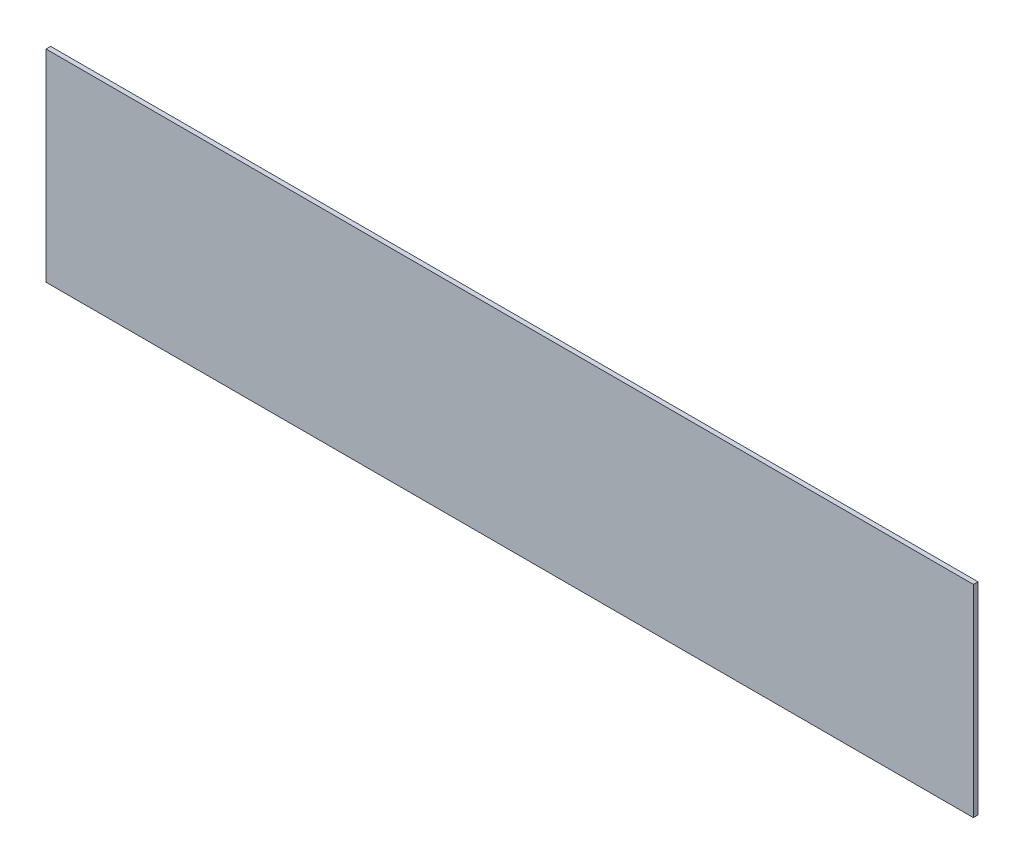
ISO-10303-21;
HEADER;
FILE_DESCRIPTION(('STEP AP214'),'2;1');
FILE_NAME('part.step','',(''),(''),'','','');
FILE_SCHEMA(('AUTOMOTIVE_DESIGN { 1 0 10303 214 1 1 1 1 }'));
ENDSEC;
DATA;
#1=APPLICATION_CONTEXT('core data for automotive mechanical design processes');
#2=APPLICATION_PROTOCOL_DEFINITION('international standard','automotive_design',2000,#1);
#3=PRODUCT_CONTEXT('',#1,'mechanical');
#4=PRODUCT('Part','Part','',(#3));
#5=PRODUCT_RELATED_PRODUCT_CATEGORY('part','',(#4));
#6=PRODUCT_DEFINITION_FORMATION('','',#4);
#7=PRODUCT_DEFINITION_CONTEXT('part definition',#1,'design');
#8=PRODUCT_DEFINITION('design','',#6,#7);
#9=PRODUCT_DEFINITION_SHAPE('','',#8);
#10=(LENGTH_UNIT() NAMED_UNIT(*) SI_UNIT(.MILLI.,.METRE.));
#11=(NAMED_UNIT(*) PLANE_ANGLE_UNIT() SI_UNIT($,.RADIAN.));
#12=(NAMED_UNIT(*) SI_UNIT($,.STERADIAN.) SOLID_ANGLE_UNIT());
#13=UNCERTAINTY_MEASURE_WITH_UNIT(LENGTH_MEASURE(1.E-05),#10,'distance_accuracy_value','');
#14=(GEOMETRIC_REPRESENTATION_CONTEXT(3) GLOBAL_UNCERTAINTY_ASSIGNED_CONTEXT((#13)) GLOBAL_UNIT_ASSIGNED_CONTEXT((#10,
#11,#12)) REPRESENTATION_CONTEXT('',''));
#15=CARTESIAN_POINT('',(0.,0.,0.));
#16=DIRECTION('',(0.,0.,1.));
#17=DIRECTION('',(1.,0.,0.));
#18=AXIS2_PLACEMENT_3D('',#15,#16,#17);
#19=CARTESIAN_POINT('',(1010.,-220.,10.));
#20=DIRECTION('',(-1.,0.,0.));
#21=DIRECTION('',(0.,0.,1.));
#22=AXIS2_PLACEMENT_3D('',#19,#20,#21);
#23=PLANE('',#22);
#24=DIRECTION('',(0.,1.,0.));
#25=VECTOR('',#24,1.);
#26=CARTESIAN_POINT('',(1010.,-220.,0.));
#27=LINE('',#26,#25);
#28=CARTESIAN_POINT('',(1010.,-220.,0.));
#29=VERTEX_POINT('',#28);
#30=CARTESIAN_POINT('',(1010.,220.,0.));
#31=VERTEX_POINT('',#30);
#32=EDGE_CURVE('E102',#29,#31,#27,.T.);
#33=ORIENTED_EDGE('',*,*,#32,.T.);
#34=DIRECTION('',(0.,0.,-1.));
#35=VECTOR('',#34,1.);
#36=CARTESIAN_POINT('',(1010.,220.,10.));
#37=LINE('',#36,#35);
#38=CARTESIAN_POINT('',(1010.,220.,10.));
#39=VERTEX_POINT('',#38);
#40=EDGE_CURVE('E11',#39,#31,#37,.T.);
#41=ORIENTED_EDGE('',*,*,#40,.F.);
#42=DIRECTION('',(0.,1.,0.));
#43=VECTOR('',#42,1.);
#44=CARTESIAN_POINT('',(1010.,-220.,10.));
#45=LINE('',#44,#43);
#46=CARTESIAN_POINT('',(1010.,-220.,10.));
#47=VERTEX_POINT('',#46);
#48=EDGE_CURVE('E90',#47,#39,#45,.T.);
#49=ORIENTED_EDGE('',*,*,#48,.F.);
#50=DIRECTION('',(0.,0.,-1.));
#51=VECTOR('',#50,1.);
#52=CARTESIAN_POINT('',(1010.,-220.,10.));
#53=LINE('',#52,#51);
#54=EDGE_CURVE('E98',#47,#29,#53,.T.);
#55=ORIENTED_EDGE('',*,*,#54,.T.);
#56=EDGE_LOOP('',(#33,#41,#49,#55));
#57=FACE_BOUND('',#56,.T.);
#58=ADVANCED_FACE('F39',(#57),#23,.F.);
#59=CARTESIAN_POINT('',(-1010.,220.,10.));
#60=DIRECTION('',(0.,-1.,0.));
#61=DIRECTION('',(0.,0.,-1.));
#62=AXIS2_PLACEMENT_3D('',#59,#60,#61);
#63=PLANE('',#62);
#64=DIRECTION('',(-1.,0.,0.));
#65=VECTOR('',#64,1.);
#66=CARTESIAN_POINT('',(-1010.,220.,0.));
#67=LINE('',#66,#65);
#68=CARTESIAN_POINT('',(-1010.,220.,0.));
#69=VERTEX_POINT('',#68);
#70=EDGE_CURVE('E94',#31,#69,#67,.T.);
#71=ORIENTED_EDGE('',*,*,#70,.T.);
#72=DIRECTION('',(0.,0.,-1.));
#73=VECTOR('',#72,1.);
#74=CARTESIAN_POINT('',(-1010.,220.,10.));
#75=LINE('',#74,#73);
#76=CARTESIAN_POINT('',(-1010.,220.,10.));
#77=VERTEX_POINT('',#76);
#78=EDGE_CURVE('E47',#77,#69,#75,.T.);
#79=ORIENTED_EDGE('',*,*,#78,.F.);
#80=DIRECTION('',(-1.,0.,0.));
#81=VECTOR('',#80,1.);
#82=CARTESIAN_POINT('',(-1010.,220.,10.));
#83=LINE('',#82,#81);
#84=EDGE_CURVE('E85',#39,#77,#83,.T.);
#85=ORIENTED_EDGE('',*,*,#84,.F.);
#86=ORIENTED_EDGE('',*,*,#40,.T.);
#87=EDGE_LOOP('',(#71,#79,#85,#86));
#88=FACE_BOUND('',#87,.T.);
#89=ADVANCED_FACE('F93',(#88),#63,.F.);
#90=CARTESIAN_POINT('',(-1010.,-220.,10.));
#91=DIRECTION('',(1.,0.,0.));
#92=DIRECTION('',(0.,0.,-1.));
#93=AXIS2_PLACEMENT_3D('',#90,#91,#92);
#94=PLANE('',#93);
#95=DIRECTION('',(0.,-1.,0.));
#96=VECTOR('',#95,1.);
#97=CARTESIAN_POINT('',(-1010.,-220.,0.));
#98=LINE('',#97,#96);
#99=CARTESIAN_POINT('',(-1010.,-220.,0.));
#100=VERTEX_POINT('',#99);
#101=EDGE_CURVE('E72',#69,#100,#98,.T.);
#102=ORIENTED_EDGE('',*,*,#101,.T.);
#103=DIRECTION('',(0.,0.,-1.));
#104=VECTOR('',#103,1.);
#105=CARTESIAN_POINT('',(-1010.,-220.,10.));
#106=LINE('',#105,#104);
#107=CARTESIAN_POINT('',(-1010.,-220.,10.));
#108=VERTEX_POINT('',#107);
#109=EDGE_CURVE('E95',#108,#100,#106,.T.);
#110=ORIENTED_EDGE('',*,*,#109,.F.);
#111=DIRECTION('',(0.,-1.,0.));
#112=VECTOR('',#111,1.);
#113=CARTESIAN_POINT('',(-1010.,-220.,10.));
#114=LINE('',#113,#112);
#115=EDGE_CURVE('E88',#77,#108,#114,.T.);
#116=ORIENTED_EDGE('',*,*,#115,.F.);
#117=ORIENTED_EDGE('',*,*,#78,.T.);
#118=EDGE_LOOP('',(#102,#110,#116,#117));
#119=FACE_BOUND('',#118,.T.);
#120=ADVANCED_FACE('F96',(#119),#94,.F.);
#121=CARTESIAN_POINT('',(-1010.,-220.,10.));
#122=DIRECTION('',(0.,1.,0.));
#123=DIRECTION('',(0.,0.,1.));
#124=AXIS2_PLACEMENT_3D('',#121,#122,#123);
#125=PLANE('',#124);
#126=DIRECTION('',(1.,0.,0.));
#127=VECTOR('',#126,1.);
#128=CARTESIAN_POINT('',(-1010.,-220.,0.));
#129=LINE('',#128,#127);
#130=EDGE_CURVE('E78',#100,#29,#129,.T.);
#131=ORIENTED_EDGE('',*,*,#130,.T.);
#132=ORIENTED_EDGE('',*,*,#54,.F.);
#133=DIRECTION('',(1.,0.,0.));
#134=VECTOR('',#133,1.);
#135=CARTESIAN_POINT('',(-1010.,-220.,10.));
#136=LINE('',#135,#134);
#137=EDGE_CURVE('E55',#108,#47,#136,.T.);
#138=ORIENTED_EDGE('',*,*,#137,.F.);
#139=ORIENTED_EDGE('',*,*,#109,.T.);
#140=EDGE_LOOP('',(#131,#132,#138,#139));
#141=FACE_BOUND('',#140,.T.);
#142=ADVANCED_FACE('F109',(#141),#125,.F.);
#143=CARTESIAN_POINT('',(0.,0.,10.));
#144=DIRECTION('',(0.,0.,-1.));
#145=DIRECTION('',(-1.,0.,0.));
#146=AXIS2_PLACEMENT_3D('',#143,#144,#145);
#147=PLANE('',#146);
#148=ORIENTED_EDGE('',*,*,#48,.T.);
#149=ORIENTED_EDGE('',*,*,#84,.T.);
#150=ORIENTED_EDGE('',*,*,#115,.T.);
#151=ORIENTED_EDGE('',*,*,#137,.T.);
#152=EDGE_LOOP('',(#148,#149,#150,#151));
#153=FACE_BOUND('',#152,.T.);
#154=ADVANCED_FACE('F86',(#153),#147,.F.);
#155=CARTESIAN_POINT('',(0.,0.,0.));
#156=DIRECTION('',(0.,0.,-1.));
#157=DIRECTION('',(-1.,0.,0.));
#158=AXIS2_PLACEMENT_3D('',#155,#156,#157);
#159=PLANE('',#158);
#160=ORIENTED_EDGE('',*,*,#32,.F.);
#161=ORIENTED_EDGE('',*,*,#130,.F.);
#162=ORIENTED_EDGE('',*,*,#101,.F.);
#163=ORIENTED_EDGE('',*,*,#70,.F.);
#164=EDGE_LOOP('',(#160,#161,#162,#163));
#165=FACE_BOUND('',#164,.T.);
#166=ADVANCED_FACE('F112',(#165),#159,.T.);
#167=CLOSED_SHELL('',(#58,#89,#120,#142,#154,#166));
#168=MANIFOLD_SOLID_BREP('B2',#167);
#169=ADVANCED_BREP_SHAPE_REPRESENTATION('',(#18,#168),#14);
#170=SHAPE_DEFINITION_REPRESENTATION(#9,#169);
ENDSEC;
END-ISO-10303-21;
